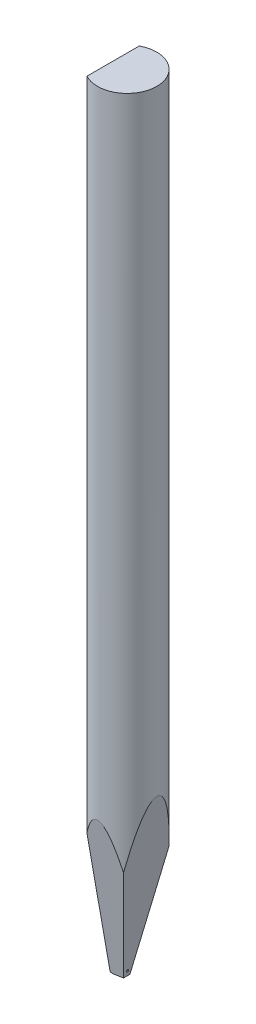
ISO-10303-21;
HEADER;
FILE_DESCRIPTION(('STEP AP214'),'2;1');
FILE_NAME('part.step','',(''),(''),'','','');
FILE_SCHEMA(('AUTOMOTIVE_DESIGN { 1 0 10303 214 1 1 1 1 }'));
ENDSEC;
DATA;
#1=APPLICATION_CONTEXT('core data for automotive mechanical design processes');
#2=APPLICATION_PROTOCOL_DEFINITION('international standard','automotive_design',2000,#1);
#3=PRODUCT_CONTEXT('',#1,'mechanical');
#4=PRODUCT('Part','Part','',(#3));
#5=PRODUCT_RELATED_PRODUCT_CATEGORY('part','',(#4));
#6=PRODUCT_DEFINITION_FORMATION('','',#4);
#7=PRODUCT_DEFINITION_CONTEXT('part definition',#1,'design');
#8=PRODUCT_DEFINITION('design','',#6,#7);
#9=PRODUCT_DEFINITION_SHAPE('','',#8);
#10=(LENGTH_UNIT() NAMED_UNIT(*) SI_UNIT(.MILLI.,.METRE.));
#11=(NAMED_UNIT(*) PLANE_ANGLE_UNIT() SI_UNIT($,.RADIAN.));
#12=(NAMED_UNIT(*) SI_UNIT($,.STERADIAN.) SOLID_ANGLE_UNIT());
#13=UNCERTAINTY_MEASURE_WITH_UNIT(LENGTH_MEASURE(1.E-05),#10,'distance_accuracy_value','');
#14=(GEOMETRIC_REPRESENTATION_CONTEXT(3) GLOBAL_UNCERTAINTY_ASSIGNED_CONTEXT((#13)) GLOBAL_UNIT_ASSIGNED_CONTEXT((#10,
#11,#12)) REPRESENTATION_CONTEXT('',''));
#15=CARTESIAN_POINT('',(0.,0.,0.));
#16=DIRECTION('',(0.,0.,1.));
#17=DIRECTION('',(1.,0.,0.));
#18=AXIS2_PLACEMENT_3D('',#15,#16,#17);
#19=CARTESIAN_POINT('',(-0.29972,0.,27.2760283406468));
#20=DIRECTION('',(-0.173648177666931,0.984807753012208,0.));
#21=DIRECTION('',(-0.984807753012208,-0.173648177666931,0.));
#22=AXIS2_PLACEMENT_3D('',#19,#20,#21);
#23=PLANE('',#22);
#24=DIRECTION('',(-0.984807753012208,-0.173648177666931,0.));
#25=VECTOR('',#24,1.);
#26=CARTESIAN_POINT('',(-0.29972,0.,0.0190499999999996));
#27=LINE('',#26,#25);
#28=CARTESIAN_POINT('',(-0.1397,0.0282158434529687,0.0190499999999998));
#29=VERTEX_POINT('',#28);
#30=CARTESIAN_POINT('',(-0.286429626386857,0.00234345145169317,0.01905));
#31=VERTEX_POINT('',#30);
#32=EDGE_CURVE('E182',#29,#31,#27,.T.);
#33=ORIENTED_EDGE('',*,*,#32,.F.);
#34=DIRECTION('',(0.,0.,1.));
#35=VECTOR('',#34,1.);
#36=CARTESIAN_POINT('',(-0.1397,0.0282158434529687,27.2760283406468));
#37=LINE('',#36,#35);
#38=CARTESIAN_POINT('',(-0.1397,0.0282158434529687,-0.0190499999999998));
#39=VERTEX_POINT('',#38);
#40=EDGE_CURVE('E11',#39,#29,#37,.T.);
#41=ORIENTED_EDGE('',*,*,#40,.F.);
#42=DIRECTION('',(-0.984807753012208,-0.173648177666931,0.));
#43=VECTOR('',#42,1.);
#44=CARTESIAN_POINT('',(-0.29972,0.,-0.0190499999999996));
#45=LINE('',#44,#43);
#46=CARTESIAN_POINT('',(-0.286429626386857,0.00234345145169317,-0.01905));
#47=VERTEX_POINT('',#46);
#48=EDGE_CURVE('E146',#39,#47,#45,.T.);
#49=ORIENTED_EDGE('',*,*,#48,.T.);
#50=CARTESIAN_POINT('',(-0.983960151536872,-0.12065,0.));
#51=DIRECTION('',(-0.173648177666931,0.984807753012208,0.));
#52=DIRECTION('',(-0.984807753012208,-0.173648177666931,0.));
#53=AXIS2_PLACEMENT_3D('',#50,#51,#52);
#54=ELLIPSE('',#53,0.716736574332053,0.12446);
#55=CARTESIAN_POINT('',(-0.29972,0.,-0.0305592719154106));
#56=VERTEX_POINT('',#55);
#57=EDGE_CURVE('E188',#47,#56,#54,.T.);
#58=ORIENTED_EDGE('',*,*,#57,.T.);
#59=DIRECTION('',(0.,0.,-1.));
#60=VECTOR('',#59,1.);
#61=CARTESIAN_POINT('',(-0.29972,0.,27.2760283406468));
#62=LINE('',#61,#60);
#63=CARTESIAN_POINT('',(-0.299719999999993,0.,-0.0762000000000001));
#64=VERTEX_POINT('',#63);
#65=EDGE_CURVE('E206',#56,#64,#62,.T.);
#66=ORIENTED_EDGE('',*,*,#65,.T.);
#67=DIRECTION('',(0.984346441568213,0.173566836012845,-0.0306045161452665));
#68=VECTOR('',#67,1.);
#69=CARTESIAN_POINT('',(26.0298035813508,4.64260539659194,-0.894816592201888));
#70=LINE('',#69,#68);
#71=CARTESIAN_POINT('',(-0.0113543651851166,0.0508466417269886,-0.0851656348148851));
#72=VERTEX_POINT('',#71);
#73=EDGE_CURVE('E248',#64,#72,#70,.T.);
#74=ORIENTED_EDGE('',*,*,#73,.T.);
#75=DIRECTION('',(0.,0.,-1.));
#76=VECTOR('',#75,1.);
#77=CARTESIAN_POINT('',(-0.0113543651851151,0.0508466417269888,27.2760283406468));
#78=LINE('',#77,#76);
#79=CARTESIAN_POINT('',(-0.0113543651851166,0.0508466417269886,0.0851656348148851));
#80=VERTEX_POINT('',#79);
#81=EDGE_CURVE('E203',#80,#72,#78,.T.);
#82=ORIENTED_EDGE('',*,*,#81,.F.);
#83=DIRECTION('',(-0.984346441568213,-0.173566836012845,-0.0306045161452665));
#84=VECTOR('',#83,1.);
#85=CARTESIAN_POINT('',(26.0298035813508,4.64260539659194,0.894816592201888));
#86=LINE('',#85,#84);
#87=CARTESIAN_POINT('',(-0.299719999999993,0.,0.0762000000000001));
#88=VERTEX_POINT('',#87);
#89=EDGE_CURVE('E216',#80,#88,#86,.T.);
#90=ORIENTED_EDGE('',*,*,#89,.T.);
#91=CARTESIAN_POINT('',(-0.29972,0.,0.0305592719154106));
#92=VERTEX_POINT('',#91);
#93=EDGE_CURVE('E207',#88,#92,#62,.T.);
#94=ORIENTED_EDGE('',*,*,#93,.T.);
#95=EDGE_CURVE('E190',#92,#31,#54,.T.);
#96=ORIENTED_EDGE('',*,*,#95,.T.);
#97=EDGE_LOOP('',(#33,#41,#49,#58,#66,#74,#82,#90,#94,#96));
#98=FACE_BOUND('',#97,.T.);
#99=ADVANCED_FACE('F42',(#98),#23,.F.);
#100=CARTESIAN_POINT('',(26.8389469491216,-0.12065,0.));
#101=DIRECTION('',(-1.,0.,0.));
#102=DIRECTION('',(0.,0.,1.));
#103=AXIS2_PLACEMENT_3D('',#100,#101,#102);
#104=CYLINDRICAL_SURFACE('',#103,0.12446);
#105=DIRECTION('',(-1.,0.,0.));
#106=VECTOR('',#105,1.);
#107=CARTESIAN_POINT('',(26.8389469491216,0.00234345145169317,0.01905));
#108=LINE('',#107,#106);
#109=CARTESIAN_POINT('',(-0.301769962417407,0.00234345145169282,0.01905));
#110=VERTEX_POINT('',#109);
#111=EDGE_CURVE('E50',#31,#110,#108,.T.);
#112=ORIENTED_EDGE('',*,*,#111,.F.);
#113=ORIENTED_EDGE('',*,*,#95,.F.);
#114=DIRECTION('',(-1.,0.,0.));
#115=VECTOR('',#114,1.);
#116=CARTESIAN_POINT('',(26.8389469491216,0.,0.0305592719154106));
#117=LINE('',#116,#115);
#118=CARTESIAN_POINT('',(-0.34798,0.,0.0305592719155763));
#119=VERTEX_POINT('',#118);
#120=EDGE_CURVE('E65',#92,#119,#117,.T.);
#121=ORIENTED_EDGE('',*,*,#120,.T.);
#122=CARTESIAN_POINT('',(-0.34798,0.,-0.0305592719154105));
#123=CARTESIAN_POINT('',(-0.348430814510365,-4.0790157401786E-07,-0.030560581386463));
#124=CARTESIAN_POINT('',(-0.348879913015498,1.08939864350477E-05,-0.0305162789202461));
#125=CARTESIAN_POINT('',(-0.349756979795945,5.32586660468888E-05,-0.0303484247483048));
#126=CARTESIAN_POINT('',(-0.350185131865885,8.40923596505527E-05,-0.0302257916828257));
#127=CARTESIAN_POINT('',(-0.351011762424045,0.000161841460247365,-0.0299134495677672));
#128=CARTESIAN_POINT('',(-0.351410362022562,0.000208686245204474,-0.0297240349657186));
#129=CARTESIAN_POINT('',(-0.352176540220128,0.000314247686217708,-0.0292915141713706));
#130=CARTESIAN_POINT('',(-0.352544019029949,0.000373000623512143,-0.0290482436791118));
#131=CARTESIAN_POINT('',(-0.353492609976714,0.000542464303570054,-0.0283352771344417));
#132=CARTESIAN_POINT('',(-0.354042823136011,0.000660718500816304,-0.0278264292093499));
#133=CARTESIAN_POINT('',(-0.355058485849617,0.000906480045085761,-0.0267326241717132));
#134=CARTESIAN_POINT('',(-0.355523692710971,0.00103401247561593,-0.0261474570746311));
#135=CARTESIAN_POINT('',(-0.356737267127974,0.00139509322037842,-0.024424665265501));
#136=CARTESIAN_POINT('',(-0.357402825120589,0.00162934905892421,-0.0232293596959535));
#137=CARTESIAN_POINT('',(-0.358560754617679,0.00207372872141576,-0.0207553925747807));
#138=CARTESIAN_POINT('',(-0.359052698197646,0.00228379206987497,-0.0194765341415885));
#139=CARTESIAN_POINT('',(-0.36030774701552,0.00284958434009851,-0.0156411550181883));
#140=CARTESIAN_POINT('',(-0.360888602450784,0.00315568845104849,-0.0130178775361172));
#141=CARTESIAN_POINT('',(-0.361706163735848,0.00360035199279706,-0.00770331230592785));
#142=CARTESIAN_POINT('',(-0.361941722221542,0.00373835258818556,-0.00501182791337141));
#143=CARTESIAN_POINT('',(-0.362122159422928,0.00384312710698266,0.000626307070904409));
#144=CARTESIAN_POINT('',(-0.362039043463169,0.00379341669557573,0.00357417277699146));
#145=CARTESIAN_POINT('',(-0.36150170314798,0.00348744188955353,0.00941520395438301));
#146=CARTESIAN_POINT('',(-0.361049465589899,0.0032322834184667,0.0123085776336631));
#147=CARTESIAN_POINT('',(-0.360101881253082,0.00276522394071858,0.0161243719322801));
#148=CARTESIAN_POINT('',(-0.359823561043634,0.00263206670724784,0.0171113029227183));
#149=CARTESIAN_POINT('',(-0.359191091592352,0.00234550293161942,0.0190622381461741));
#150=CARTESIAN_POINT('',(-0.358836664817193,0.00219202308727775,0.0200261437209395));
#151=CARTESIAN_POINT('',(-0.35792019094462,0.00182196264863964,0.0221910750494741));
#152=CARTESIAN_POINT('',(-0.35732773854375,0.00160009037378041,0.0233785738678838));
#153=CARTESIAN_POINT('',(-0.355941185679961,0.00114822728257018,0.0256274014231926));
#154=CARTESIAN_POINT('',(-0.35514861217987,0.000918308819136108,0.0266895999907303));
#155=CARTESIAN_POINT('',(-0.353869594547934,0.000625501592054897,0.027976474269296));
#156=CARTESIAN_POINT('',(-0.353498623594593,0.000547541257563668,0.0283116735867265));
#157=CARTESIAN_POINT('',(-0.352713845163361,0.000401035258663639,0.0289316105181223));
#158=CARTESIAN_POINT('',(-0.352300015965373,0.000332494409296592,0.0292163223453788));
#159=CARTESIAN_POINT('',(-0.35142414885153,0.000209524327572587,0.0297209697927657));
#160=CARTESIAN_POINT('',(-0.350961529273433,0.000155300800887052,0.0299399667559707));
#161=CARTESIAN_POINT('',(-0.350001496573154,6.91140443385488E-05,0.030285638001186));
#162=CARTESIAN_POINT('',(-0.349504228801302,3.70633361955864E-05,0.0304126751846489));
#163=CARTESIAN_POINT('',(-0.348830789757912,1.24370193427594E-05,0.0305101337557273));
#164=CARTESIAN_POINT('',(-0.348661251457123,7.78649892713723E-06,0.0305285162109277));
#165=CARTESIAN_POINT('',(-0.348321176485651,1.56788977353475E-06,0.0305530840375707));
#166=CARTESIAN_POINT('',(-0.348150639475355,9.18970805127776E-10,0.0305592649853819));
#167=CARTESIAN_POINT('',(-0.347980000000024,0.,0.0305592719155779));
#168=B_SPLINE_CURVE_WITH_KNOTS('',3,(#122,#123,#124,#125,#126,#127,#128,#129,#130,#131,#132,
#133,#134,#135,#136,#137,#138,#139,#140,#141,#142,#143,#144,#145,#146,#147,#148,#149,#150,#151,
#152,#153,#154,#155,#156,#157,#158,#159,#160,#161,#162,#163,#164,#165,#166,#167),.UNSPECIFIED.,
.F.,.F.,(4,2,2,2,2,2,2,2,2,2,2,2,2,2,2,2,2,2,2,2,2,2,4),(0.,0.00134741004079565,
0.00267930111383719,0.00400539168870872,0.00533558497102969,0.00759858100656418,
0.00986794025135302,0.0140085166125864,0.0181592285296514,0.0262271883927134,0.0343218964425103,
0.0431433167180924,0.0519175663828487,0.0550173321670425,0.0581285996977776,0.0621538633051677,
0.0661492954960546,0.0676639727026794,0.0691794213229861,0.0707155853403851,0.0722456536356855,
0.0727570681004673,0.0732686679434896),.UNSPECIFIED.);
#169=CARTESIAN_POINT('',(-0.347980000000001,0.,-0.0305592719154106));
#170=VERTEX_POINT('',#169);
#171=EDGE_CURVE('E254',#170,#119,#168,.T.);
#172=ORIENTED_EDGE('',*,*,#171,.F.);
#173=DIRECTION('',(-1.,0.,0.));
#174=VECTOR('',#173,1.);
#175=CARTESIAN_POINT('',(26.8389469491216,0.,-0.0305592719154106));
#176=LINE('',#175,#174);
#177=EDGE_CURVE('E185',#56,#170,#176,.T.);
#178=ORIENTED_EDGE('',*,*,#177,.F.);
#179=ORIENTED_EDGE('',*,*,#57,.F.);
#180=DIRECTION('',(-1.,0.,0.));
#181=VECTOR('',#180,1.);
#182=CARTESIAN_POINT('',(26.8389469491216,0.00234345145169317,-0.01905));
#183=LINE('',#182,#181);
#184=CARTESIAN_POINT('',(-0.301769962417407,0.00234345145169364,-0.01905));
#185=VERTEX_POINT('',#184);
#186=EDGE_CURVE('E262',#47,#185,#183,.T.);
#187=ORIENTED_EDGE('',*,*,#186,.T.);
#188=CARTESIAN_POINT('',(-0.301769962417407,0.00234345145169314,-0.01905));
#189=CARTESIAN_POINT('',(-0.303083212357795,0.00234273884135903,-0.0190505532683335));
#190=CARTESIAN_POINT('',(-0.304398530056794,0.00235919648592935,-0.0189481276282325));
#191=CARTESIAN_POINT('',(-0.307000954094572,0.00242318594032791,-0.0185302442706134));
#192=CARTESIAN_POINT('',(-0.308287873692993,0.00247088218091991,-0.0182136589885027));
#193=CARTESIAN_POINT('',(-0.310790852582439,0.00259423811870583,-0.0173587153989119));
#194=CARTESIAN_POINT('',(-0.312006641691863,0.00266999731654825,-0.0168195671794881));
#195=CARTESIAN_POINT('',(-0.314311894657055,0.00283986679158173,-0.015523243690556));
#196=CARTESIAN_POINT('',(-0.315401659849181,0.00293393178806268,-0.0147666042420507));
#197=CARTESIAN_POINT('',(-0.31730332104955,0.00311685645192294,-0.0131397171256992));
#198=CARTESIAN_POINT('',(-0.318132319467869,0.00320524260215012,-0.0122894206437063));
#199=CARTESIAN_POINT('',(-0.3196165652278,0.00337418177810725,-0.0104472759959153));
#200=CARTESIAN_POINT('',(-0.320271844381019,0.00345473623626944,-0.00945545379765719));
#201=CARTESIAN_POINT('',(-0.3213234426909,0.00358935319513246,-0.00746762605607109));
#202=CARTESIAN_POINT('',(-0.32173909228563,0.00364525831027112,-0.00648193686690554));
#203=CARTESIAN_POINT('',(-0.322389726393463,0.00373449435681656,-0.0044518189481206));
#204=CARTESIAN_POINT('',(-0.322624798676981,0.00376783625423748,-0.00340741902037943));
#205=CARTESIAN_POINT('',(-0.322897837996913,0.00380671319708877,-0.00134948273672548));
#206=CARTESIAN_POINT('',(-0.322945634936013,0.00381363450040313,-0.000337264641997512));
#207=CARTESIAN_POINT('',(-0.322869697716228,0.00380274111245844,0.00168052629893266));
#208=CARTESIAN_POINT('',(-0.322745983850237,0.00378492934757725,0.00268609991715538));
#209=CARTESIAN_POINT('',(-0.322334355344498,0.00372702254235129,0.0046473278957709));
#210=CARTESIAN_POINT('',(-0.322048793640665,0.00368724701865936,0.00560348787902325));
#211=CARTESIAN_POINT('',(-0.321324937242233,0.00358998817113897,0.00745501684823445));
#212=CARTESIAN_POINT('',(-0.320886639683836,0.00353250451528526,0.00835038469396416));
#213=CARTESIAN_POINT('',(-0.319862680839835,0.00340476764403495,0.0100730618825254));
#214=CARTESIAN_POINT('',(-0.319274533821476,0.00333430521919907,0.0108988749361181));
#215=CARTESIAN_POINT('',(-0.317974173980919,0.00318863460274331,0.0124454369952645));
#216=CARTESIAN_POINT('',(-0.317261944798882,0.00311342578616174,0.0131661721235828));
#217=CARTESIAN_POINT('',(-0.31569583062112,0.00296171888527247,0.0145232749481605));
#218=CARTESIAN_POINT('',(-0.314836555870207,0.00288535232362802,0.0151534243532859));
#219=CARTESIAN_POINT('',(-0.313030647680624,0.00274271134593144,0.0162742350252514));
#220=CARTESIAN_POINT('',(-0.312083969657596,0.00267644212671652,0.0167648245761543));
#221=CARTESIAN_POINT('',(-0.31004264333725,0.00255444746912226,0.0176399463518506));
#222=CARTESIAN_POINT('',(-0.308942302803632,0.00250016076595805,0.0180113663892418));
#223=CARTESIAN_POINT('',(-0.306698785837096,0.00241476087320615,0.0185861575843008));
#224=CARTESIAN_POINT('',(-0.305555627526932,0.00238363799331208,0.0187895990176943));
#225=CARTESIAN_POINT('',(-0.30352895790095,0.00235048998193052,0.0190043678177182));
#226=CARTESIAN_POINT('',(-0.302649080375743,0.00234326902739348,0.0190501179681685));
#227=CARTESIAN_POINT('',(-0.301769962417412,0.00234345145168755,0.0190500000000401));
#228=B_SPLINE_CURVE_WITH_KNOTS('',3,(#188,#189,#190,#191,#192,#193,#194,#195,#196,#197,#198,
#199,#200,#201,#202,#203,#204,#205,#206,#207,#208,#209,#210,#211,#212,#213,#214,#215,#216,#217,
#218,#219,#220,#221,#222,#223,#224,#225,#226,#227),.UNSPECIFIED.,.F.,.F.,(4,2,2,2,2,2,2,2,2,2,2,
2,2,2,2,2,2,2,2,4),(0.,0.0039388640861778,0.00789862964445358,0.0118725715602336,
0.0158368057995756,0.0193894604666261,0.0229414641187126,0.0261386218593387,0.0293342246220546,
0.0323596502009959,0.0353847178468262,0.0383668955619843,0.0413491291960031,0.0443844811882459,
0.0474202336852696,0.0506115954385173,0.0538045941937902,0.0572782451267952,0.0607504420817328,
0.063388074501748),.UNSPECIFIED.);
#229=EDGE_CURVE('E277',#185,#110,#228,.T.);
#230=ORIENTED_EDGE('',*,*,#229,.T.);
#231=EDGE_LOOP('',(#112,#113,#121,#172,#178,#179,#187,#230));
#232=FACE_BOUND('',#231,.T.);
#233=ADVANCED_FACE('F267',(#232),#104,.F.);
#234=CARTESIAN_POINT('',(0.,0.,0.));
#235=DIRECTION('',(0.,1.,0.));
#236=DIRECTION('',(0.,0.,1.));
#237=AXIS2_PLACEMENT_3D('',#234,#235,#236);
#238=PLANE('',#237);
#239=ORIENTED_EDGE('',*,*,#120,.F.);
#240=ORIENTED_EDGE('',*,*,#93,.F.);
#241=DIRECTION('',(-1.,0.,0.));
#242=VECTOR('',#241,1.);
#243=CARTESIAN_POINT('',(26.8738719491216,0.,0.0762));
#244=LINE('',#243,#242);
#245=CARTESIAN_POINT('',(-0.34798,0.,0.0761999999999992));
#246=VERTEX_POINT('',#245);
#247=EDGE_CURVE('E219',#88,#246,#244,.T.);
#248=ORIENTED_EDGE('',*,*,#247,.T.);
#249=DIRECTION('',(0.,0.,-1.));
#250=VECTOR('',#249,1.);
#251=CARTESIAN_POINT('',(-0.34798,0.,26.4992219491216));
#252=LINE('',#251,#250);
#253=EDGE_CURVE('E194',#246,#119,#252,.T.);
#254=ORIENTED_EDGE('',*,*,#253,.T.);
#255=EDGE_LOOP('',(#239,#240,#248,#254));
#256=FACE_BOUND('',#255,.T.);
#257=ADVANCED_FACE('F271',(#256),#238,.F.);
#258=CARTESIAN_POINT('',(26.8738719491216,0.,0.0762));
#259=DIRECTION('',(0.,-0.173648177666931,0.984807753012208));
#260=DIRECTION('',(0.,-0.984807753012208,-0.173648177666931));
#261=AXIS2_PLACEMENT_3D('',#258,#259,#260);
#262=PLANE('',#261);
#263=CARTESIAN_POINT('',(-0.34798,0.02794,0.0811265758409938));
#264=DIRECTION('',(0.,-0.173648177666931,0.984807753012208));
#265=DIRECTION('',(0.,-0.984807753012208,-0.173648177666931));
#266=AXIS2_PLACEMENT_3D('',#263,#264,#265);
#267=ELLIPSE('',#266,0.0283710195360877,0.02794);
#268=CARTESIAN_POINT('',(-0.37592,0.02794,0.0811265758409938));
#269=VERTEX_POINT('',#268);
#270=EDGE_CURVE('E197',#246,#269,#267,.F.);
#271=ORIENTED_EDGE('',*,*,#270,.F.);
#272=ORIENTED_EDGE('',*,*,#247,.F.);
#273=ORIENTED_EDGE('',*,*,#89,.F.);
#274=DIRECTION('',(-0.171087869746036,-0.970287525247814,-0.171087869746036));
#275=VECTOR('',#274,1.);
#276=CARTESIAN_POINT('',(0.766901483986011,4.46455489014234,0.863421483986016));
#277=LINE('',#276,#275);
#278=CARTESIAN_POINT('',(0.510025990868476,3.00774157611953,0.606545990868479));
#279=VERTEX_POINT('',#278);
#280=EDGE_CURVE('E213',#279,#80,#277,.T.);
#281=ORIENTED_EDGE('',*,*,#280,.F.);
#282=CARTESIAN_POINT('',(0.,-0.432151674654869,0.));
#283=DIRECTION('',(0.,-0.173648177666931,0.984807753012208));
#284=DIRECTION('',(0.,-0.984807753012208,-0.173648177666931));
#285=AXIS2_PLACEMENT_3D('',#282,#283,#284);
#286=ELLIPSE('',#285,4.56371043248163,0.792479999999998);
#287=CARTESIAN_POINT('',(-0.37592,3.52439037249585,0.69764511322018));
#288=VERTEX_POINT('',#287);
#289=EDGE_CURVE('E225',#279,#288,#286,.T.);
#290=ORIENTED_EDGE('',*,*,#289,.T.);
#291=DIRECTION('',(0.,0.984807753012208,0.173648177666931));
#292=VECTOR('',#291,1.);
#293=CARTESIAN_POINT('',(-0.37592,20.2050421358819,3.63889407490738));
#294=LINE('',#293,#292);
#295=EDGE_CURVE('E240',#269,#288,#294,.T.);
#296=ORIENTED_EDGE('',*,*,#295,.F.);
#297=EDGE_LOOP('',(#271,#272,#273,#281,#290,#296));
#298=FACE_BOUND('',#297,.T.);
#299=ADVANCED_FACE('F303',(#298),#262,.T.);
#300=CARTESIAN_POINT('',(26.8738719491216,0.,-0.0762));
#301=DIRECTION('',(0.,-0.173648177666931,-0.984807753012208));
#302=DIRECTION('',(0.,0.984807753012208,-0.173648177666931));
#303=AXIS2_PLACEMENT_3D('',#300,#301,#302);
#304=PLANE('',#303);
#305=CARTESIAN_POINT('',(-0.34798,0.02794,-0.0811265758409938));
#306=DIRECTION('',(0.,-0.173648177666931,-0.984807753012208));
#307=DIRECTION('',(0.,0.984807753012208,-0.173648177666931));
#308=AXIS2_PLACEMENT_3D('',#305,#306,#307);
#309=ELLIPSE('',#308,0.0283710195360877,0.02794);
#310=CARTESIAN_POINT('',(-0.37592,0.02794,-0.0811265758409938));
#311=VERTEX_POINT('',#310);
#312=CARTESIAN_POINT('',(-0.34798,0.,-0.0761999999999985));
#313=VERTEX_POINT('',#312);
#314=EDGE_CURVE('E251',#311,#313,#309,.F.);
#315=ORIENTED_EDGE('',*,*,#314,.F.);
#316=DIRECTION('',(0.,-0.984807753012208,0.173648177666931));
#317=VECTOR('',#316,1.);
#318=CARTESIAN_POINT('',(-0.37592,20.5629593754693,-3.70200454110734));
#319=LINE('',#318,#317);
#320=CARTESIAN_POINT('',(-0.37592,3.52439037249586,-0.69764511322018));
#321=VERTEX_POINT('',#320);
#322=EDGE_CURVE('E242',#321,#311,#319,.T.);
#323=ORIENTED_EDGE('',*,*,#322,.F.);
#324=CARTESIAN_POINT('',(0.,-0.432151674654869,0.));
#325=DIRECTION('',(0.,-0.173648177666931,-0.984807753012208));
#326=DIRECTION('',(0.,-0.984807753012208,0.173648177666931));
#327=AXIS2_PLACEMENT_3D('',#324,#325,#326);
#328=ELLIPSE('',#327,4.56371043248163,0.792479999999998);
#329=CARTESIAN_POINT('',(0.510025990868476,3.00774157611953,-0.606545990868479));
#330=VERTEX_POINT('',#329);
#331=EDGE_CURVE('E228',#321,#330,#328,.T.);
#332=ORIENTED_EDGE('',*,*,#331,.T.);
#333=DIRECTION('',(0.171087869746036,0.970287525247814,-0.171087869746036));
#334=VECTOR('',#333,1.);
#335=CARTESIAN_POINT('',(0.766901483986011,4.46455489014234,-0.863421483986016));
#336=LINE('',#335,#334);
#337=EDGE_CURVE('E245',#72,#330,#336,.T.);
#338=ORIENTED_EDGE('',*,*,#337,.F.);
#339=ORIENTED_EDGE('',*,*,#73,.F.);
#340=DIRECTION('',(-1.,0.,0.));
#341=VECTOR('',#340,1.);
#342=CARTESIAN_POINT('',(26.8738719491216,0.,-0.0762));
#343=LINE('',#342,#341);
#344=EDGE_CURVE('E222',#64,#313,#343,.T.);
#345=ORIENTED_EDGE('',*,*,#344,.T.);
#346=EDGE_LOOP('',(#315,#323,#332,#338,#339,#345));
#347=FACE_BOUND('',#346,.T.);
#348=ADVANCED_FACE('F311',(#347),#304,.T.);
#349=ORIENTED_EDGE('',*,*,#65,.F.);
#350=ORIENTED_EDGE('',*,*,#177,.T.);
#351=EDGE_CURVE('E198',#170,#313,#252,.T.);
#352=ORIENTED_EDGE('',*,*,#351,.T.);
#353=ORIENTED_EDGE('',*,*,#344,.F.);
#354=EDGE_LOOP('',(#349,#350,#352,#353));
#355=FACE_BOUND('',#354,.T.);
#356=ADVANCED_FACE('F313',(#355),#238,.F.);
#357=CARTESIAN_POINT('',(0.,21.0312,0.));
#358=DIRECTION('',(0.,-1.,0.));
#359=DIRECTION('',(0.,0.,-1.));
#360=AXIS2_PLACEMENT_3D('',#357,#358,#359);
#361=CYLINDRICAL_SURFACE('',#360,0.792479999999998);
#362=ORIENTED_EDGE('',*,*,#289,.F.);
#363=CARTESIAN_POINT('',(0.,0.115240446574631,0.));
#364=DIRECTION('',(-0.984807753012208,0.173648177666931,0.));
#365=DIRECTION('',(-0.173648177666931,-0.984807753012208,0.));
#366=AXIS2_PLACEMENT_3D('',#363,#364,#365);
#367=ELLIPSE('',#366,4.56371043248165,0.792479999999998);
#368=EDGE_CURVE('E210',#279,#330,#367,.T.);
#369=ORIENTED_EDGE('',*,*,#368,.T.);
#370=ORIENTED_EDGE('',*,*,#331,.F.);
#371=DIRECTION('',(0.,-1.,0.));
#372=VECTOR('',#371,1.);
#373=CARTESIAN_POINT('',(-0.37592,21.0312,-0.69764511322018));
#374=LINE('',#373,#372);
#375=CARTESIAN_POINT('',(-0.37592,21.0312,-0.69764511322018));
#376=VERTEX_POINT('',#375);
#377=EDGE_CURVE('E234',#376,#321,#374,.T.);
#378=ORIENTED_EDGE('',*,*,#377,.F.);
#379=CARTESIAN_POINT('',(0.,21.0312,0.));
#380=DIRECTION('',(0.,1.,0.));
#381=DIRECTION('',(0.,0.,1.));
#382=AXIS2_PLACEMENT_3D('',#379,#380,#381);
#383=CIRCLE('',#382,0.792479999999998);
#384=CARTESIAN_POINT('',(-0.37592,21.0312,0.69764511322018));
#385=VERTEX_POINT('',#384);
#386=EDGE_CURVE('E237',#385,#376,#383,.T.);
#387=ORIENTED_EDGE('',*,*,#386,.F.);
#388=DIRECTION('',(0.,-1.,0.));
#389=VECTOR('',#388,1.);
#390=CARTESIAN_POINT('',(-0.37592,21.0312,0.69764511322018));
#391=LINE('',#390,#389);
#392=EDGE_CURVE('E232',#288,#385,#391,.F.);
#393=ORIENTED_EDGE('',*,*,#392,.F.);
#394=EDGE_LOOP('',(#362,#369,#370,#378,#387,#393));
#395=FACE_BOUND('',#394,.T.);
#396=ADVANCED_FACE('F44',(#395),#361,.T.);
#397=CARTESIAN_POINT('',(-0.37592,21.0312,-1.04648));
#398=DIRECTION('',(-1.,0.,0.));
#399=DIRECTION('',(0.,0.,1.));
#400=AXIS2_PLACEMENT_3D('',#397,#398,#399);
#401=PLANE('',#400);
#402=DIRECTION('',(0.,0.,-1.));
#403=VECTOR('',#402,1.);
#404=CARTESIAN_POINT('',(-0.37592,0.02794,26.4992219491216));
#405=LINE('',#404,#403);
#406=EDGE_CURVE('E193',#269,#311,#405,.T.);
#407=ORIENTED_EDGE('',*,*,#406,.F.);
#408=ORIENTED_EDGE('',*,*,#295,.T.);
#409=ORIENTED_EDGE('',*,*,#392,.T.);
#410=DIRECTION('',(0.,0.,-1.));
#411=VECTOR('',#410,1.);
#412=CARTESIAN_POINT('',(-0.37592,21.0312,-1.04648));
#413=LINE('',#412,#411);
#414=EDGE_CURVE('E230',#385,#376,#413,.T.);
#415=ORIENTED_EDGE('',*,*,#414,.T.);
#416=ORIENTED_EDGE('',*,*,#377,.T.);
#417=ORIENTED_EDGE('',*,*,#322,.T.);
#418=EDGE_LOOP('',(#407,#408,#409,#415,#416,#417));
#419=FACE_BOUND('',#418,.T.);
#420=ADVANCED_FACE('F319',(#419),#401,.T.);
#421=CARTESIAN_POINT('',(0.,21.0312,0.));
#422=DIRECTION('',(0.,1.,0.));
#423=DIRECTION('',(0.,0.,1.));
#424=AXIS2_PLACEMENT_3D('',#421,#422,#423);
#425=PLANE('',#424);
#426=ORIENTED_EDGE('',*,*,#386,.T.);
#427=ORIENTED_EDGE('',*,*,#414,.F.);
#428=EDGE_LOOP('',(#426,#427));
#429=FACE_BOUND('',#428,.T.);
#430=ADVANCED_FACE('F292',(#429),#425,.T.);
#431=CARTESIAN_POINT('',(-0.0113543651851151,0.0508466417269888,27.2760283406468));
#432=DIRECTION('',(-0.984807753012208,0.173648177666931,0.));
#433=DIRECTION('',(-0.173648177666931,-0.984807753012208,0.));
#434=AXIS2_PLACEMENT_3D('',#431,#432,#433);
#435=PLANE('',#434);
#436=CARTESIAN_POINT('',(0.0122922911853769,0.184953494095707,0.));
#437=DIRECTION('',(-0.984807753012208,0.173648177666931,0.));
#438=DIRECTION('',(0.173648177666931,0.984807753012208,0.));
#439=AXIS2_PLACEMENT_3D('',#436,#437,#438);
#440=ELLIPSE('',#439,0.0336182099567053,0.0252651922242437);
#441=CARTESIAN_POINT('',(0.0181300320807831,0.218060967903463,0.));
#442=VERTEX_POINT('',#441);
#443=EDGE_CURVE('E184',#442,#442,#440,.F.);
#444=ORIENTED_EDGE('',*,*,#443,.F.);
#445=EDGE_LOOP('',(#444));
#446=FACE_BOUND('',#445,.T.);
#447=ORIENTED_EDGE('',*,*,#368,.F.);
#448=ORIENTED_EDGE('',*,*,#280,.T.);
#449=ORIENTED_EDGE('',*,*,#81,.T.);
#450=ORIENTED_EDGE('',*,*,#337,.T.);
#451=EDGE_LOOP('',(#447,#448,#449,#450));
#452=FACE_BOUND('',#451,.T.);
#453=ADVANCED_FACE('F289',(#446,#452),#435,.F.);
#454=CARTESIAN_POINT('',(-0.34798,0.02794,26.4992219491216));
#455=DIRECTION('',(0.,0.,-1.));
#456=DIRECTION('',(-1.,0.,0.));
#457=AXIS2_PLACEMENT_3D('',#454,#455,#456);
#458=CYLINDRICAL_SURFACE('',#457,0.02794);
#459=ORIENTED_EDGE('',*,*,#351,.F.);
#460=ORIENTED_EDGE('',*,*,#171,.T.);
#461=ORIENTED_EDGE('',*,*,#253,.F.);
#462=ORIENTED_EDGE('',*,*,#270,.T.);
#463=ORIENTED_EDGE('',*,*,#406,.T.);
#464=ORIENTED_EDGE('',*,*,#314,.T.);
#465=EDGE_LOOP('',(#459,#460,#461,#462,#463,#464));
#466=FACE_BOUND('',#465,.T.);
#467=ADVANCED_FACE('F264',(#466),#458,.T.);
#468=CARTESIAN_POINT('',(-0.1397,0.09144,0.01905));
#469=DIRECTION('',(-1.,0.,0.));
#470=DIRECTION('',(0.,-1.,0.));
#471=AXIS2_PLACEMENT_3D('',#468,#469,#470);
#472=PLANE('',#471);
#473=ORIENTED_EDGE('',*,*,#40,.T.);
#474=DIRECTION('',(0.,1.,0.));
#475=VECTOR('',#474,1.);
#476=CARTESIAN_POINT('',(-0.1397,0.09144,0.01905));
#477=LINE('',#476,#475);
#478=CARTESIAN_POINT('',(-0.1397,0.09144,0.01905));
#479=VERTEX_POINT('',#478);
#480=EDGE_CURVE('E156',#29,#479,#477,.T.);
#481=ORIENTED_EDGE('',*,*,#480,.T.);
#482=CARTESIAN_POINT('',(-0.1397,0.0914400000000001,0.));
#483=DIRECTION('',(-1.,0.,0.));
#484=DIRECTION('',(0.,1.,0.));
#485=AXIS2_PLACEMENT_3D('',#482,#483,#484);
#486=ELLIPSE('',#485,0.0219970452561247,0.01905);
#487=CARTESIAN_POINT('',(-0.1397,0.09144,-0.01905));
#488=VERTEX_POINT('',#487);
#489=EDGE_CURVE('E152',#479,#488,#486,.F.);
#490=ORIENTED_EDGE('',*,*,#489,.T.);
#491=DIRECTION('',(0.,1.,0.));
#492=VECTOR('',#491,1.);
#493=CARTESIAN_POINT('',(-0.1397,0.09144,-0.01905));
#494=LINE('',#493,#492);
#495=EDGE_CURVE('E140',#39,#488,#494,.T.);
#496=ORIENTED_EDGE('',*,*,#495,.F.);
#497=EDGE_LOOP('',(#473,#481,#490,#496));
#498=FACE_BOUND('',#497,.T.);
#499=ADVANCED_FACE('F154',(#498),#472,.T.);
#500=CARTESIAN_POINT('',(-0.0103574919504674,0.166115931840058,0.));
#501=DIRECTION('',(0.866025403784441,0.499999999999995,0.));
#502=DIRECTION('',(-0.499999999999995,0.866025403784441,0.));
#503=AXIS2_PLACEMENT_3D('',#500,#501,#502);
#504=CONICAL_SURFACE('',#503,0.01905,0.226892802759263);
#505=CARTESIAN_POINT('',(-0.0103574919504674,0.166115931840058,0.));
#506=DIRECTION('',(0.866025403784441,0.499999999999995,0.));
#507=DIRECTION('',(-0.499999999999995,0.866025403784441,0.));
#508=AXIS2_PLACEMENT_3D('',#505,#506,#507);
#509=CIRCLE('',#508,0.01905);
#510=CARTESIAN_POINT('',(-0.0198824919504673,0.182613715782152,0.));
#511=VERTEX_POINT('',#510);
#512=EDGE_CURVE('E160',#511,#511,#509,.T.);
#513=ORIENTED_EDGE('',*,*,#512,.F.);
#514=EDGE_LOOP('',(#513));
#515=FACE_BOUND('',#514,.T.);
#516=ORIENTED_EDGE('',*,*,#443,.T.);
#517=EDGE_LOOP('',(#516));
#518=FACE_BOUND('',#517,.T.);
#519=ADVANCED_FACE('F287',(#515,#518),#504,.F.);
#520=CARTESIAN_POINT('',(-0.250330046129175,0.09144,0.));
#521=DIRECTION('',(-0.500000000000004,-0.866025403784436,0.));
#522=DIRECTION('',(0.866025403784436,-0.500000000000004,0.));
#523=AXIS2_PLACEMENT_3D('',#520,#521,#522);
#524=CYLINDRICAL_SURFACE('',#523,0.01905);
#525=DIRECTION('',(0.500000000000004,0.866025403784436,0.));
#526=VECTOR('',#525,1.);
#527=CARTESIAN_POINT('',(-0.250330046129175,0.09144,-0.01905));
#528=LINE('',#527,#526);
#529=CARTESIAN_POINT('',(-0.250330046129175,0.09144,-0.01905));
#530=VERTEX_POINT('',#529);
#531=EDGE_CURVE('E57',#185,#530,#528,.T.);
#532=ORIENTED_EDGE('',*,*,#531,.T.);
#533=CARTESIAN_POINT('',(-0.250330046129175,0.09144,0.));
#534=DIRECTION('',(0.,-1.,0.));
#535=DIRECTION('',(-1.,0.,0.));
#536=AXIS2_PLACEMENT_3D('',#533,#534,#535);
#537=ELLIPSE('',#536,0.0219970452561248,0.01905);
#538=CARTESIAN_POINT('',(-0.250330046129175,0.09144,0.01905));
#539=VERTEX_POINT('',#538);
#540=EDGE_CURVE('E169',#530,#539,#537,.F.);
#541=ORIENTED_EDGE('',*,*,#540,.T.);
#542=DIRECTION('',(-0.500000000000004,-0.866025403784436,0.));
#543=VECTOR('',#542,1.);
#544=CARTESIAN_POINT('',(-0.227342216057905,0.131256089639199,0.01905));
#545=LINE('',#544,#543);
#546=EDGE_CURVE('E176',#539,#110,#545,.T.);
#547=ORIENTED_EDGE('',*,*,#546,.T.);
#548=ORIENTED_EDGE('',*,*,#229,.F.);
#549=EDGE_LOOP('',(#532,#541,#547,#548));
#550=FACE_BOUND('',#549,.T.);
#551=ADVANCED_FACE('F273',(#550),#524,.F.);
#552=CARTESIAN_POINT('',(0.,0.,0.01905));
#553=DIRECTION('',(0.,0.,-1.));
#554=DIRECTION('',(-1.,0.,0.));
#555=AXIS2_PLACEMENT_3D('',#552,#553,#554);
#556=PLANE('',#555);
#557=ORIENTED_EDGE('',*,*,#32,.T.);
#558=ORIENTED_EDGE('',*,*,#111,.T.);
#559=ORIENTED_EDGE('',*,*,#546,.F.);
#560=DIRECTION('',(-1.,0.,0.));
#561=VECTOR('',#560,1.);
#562=CARTESIAN_POINT('',(-0.2723270913853,0.09144,0.01905));
#563=LINE('',#562,#561);
#564=EDGE_CURVE('E149',#479,#539,#563,.T.);
#565=ORIENTED_EDGE('',*,*,#564,.F.);
#566=ORIENTED_EDGE('',*,*,#480,.F.);
#567=EDGE_LOOP('',(#557,#558,#559,#565,#566));
#568=FACE_BOUND('',#567,.T.);
#569=ADVANCED_FACE('F436',(#568),#556,.T.);
#570=CARTESIAN_POINT('',(0.,0.,-0.01905));
#571=DIRECTION('',(0.,0.,-1.));
#572=DIRECTION('',(-1.,0.,0.));
#573=AXIS2_PLACEMENT_3D('',#570,#571,#572);
#574=PLANE('',#573);
#575=ORIENTED_EDGE('',*,*,#495,.T.);
#576=DIRECTION('',(-1.,0.,0.));
#577=VECTOR('',#576,1.);
#578=CARTESIAN_POINT('',(-0.2723270913853,0.09144,-0.01905));
#579=LINE('',#578,#577);
#580=EDGE_CURVE('E144',#488,#530,#579,.T.);
#581=ORIENTED_EDGE('',*,*,#580,.T.);
#582=ORIENTED_EDGE('',*,*,#531,.F.);
#583=ORIENTED_EDGE('',*,*,#186,.F.);
#584=ORIENTED_EDGE('',*,*,#48,.F.);
#585=EDGE_LOOP('',(#575,#581,#582,#583,#584));
#586=FACE_BOUND('',#585,.T.);
#587=ADVANCED_FACE('F142',(#586),#574,.F.);
#588=CARTESIAN_POINT('',(-0.2723270913853,0.09144,0.01905));
#589=DIRECTION('',(0.,-1.,0.));
#590=DIRECTION('',(0.,0.,-1.));
#591=AXIS2_PLACEMENT_3D('',#588,#589,#590);
#592=PLANE('',#591);
#593=ORIENTED_EDGE('',*,*,#580,.F.);
#594=CARTESIAN_POINT('',(-0.1397,0.09144,0.));
#595=DIRECTION('',(0.,-1.,0.));
#596=DIRECTION('',(1.,0.,0.));
#597=AXIS2_PLACEMENT_3D('',#594,#595,#596);
#598=ELLIPSE('',#597,0.0381000000000004,0.01905);
#599=EDGE_CURVE('E161',#488,#479,#598,.F.);
#600=ORIENTED_EDGE('',*,*,#599,.T.);
#601=ORIENTED_EDGE('',*,*,#564,.T.);
#602=ORIENTED_EDGE('',*,*,#540,.F.);
#603=EDGE_LOOP('',(#593,#600,#601,#602));
#604=FACE_BOUND('',#603,.T.);
#605=ADVANCED_FACE('F168',(#604),#592,.T.);
#606=CARTESIAN_POINT('',(-0.320091732268594,-0.0127092151848543,0.));
#607=DIRECTION('',(0.866025403784441,0.499999999999995,0.));
#608=DIRECTION('',(-0.499999999999995,0.866025403784441,0.));
#609=AXIS2_PLACEMENT_3D('',#606,#607,#608);
#610=CYLINDRICAL_SURFACE('',#609,0.01905);
#611=ORIENTED_EDGE('',*,*,#512,.T.);
#612=EDGE_LOOP('',(#611));
#613=FACE_BOUND('',#612,.T.);
#614=ORIENTED_EDGE('',*,*,#489,.F.);
#615=ORIENTED_EDGE('',*,*,#599,.F.);
#616=EDGE_LOOP('',(#614,#615));
#617=FACE_BOUND('',#616,.T.);
#618=ADVANCED_FACE('F163',(#613,#617),#610,.F.);
#619=CLOSED_SHELL('',(#99,#233,#257,#299,#348,#356,#396,#420,#430,#453,#467,#499,#519,#551,#569,
#587,#605,#618));
#620=MANIFOLD_SOLID_BREP('B2',#619);
#621=ADVANCED_BREP_SHAPE_REPRESENTATION('',(#18,#620),#14);
#622=SHAPE_DEFINITION_REPRESENTATION(#9,#621);
ENDSEC;
END-ISO-10303-21;
